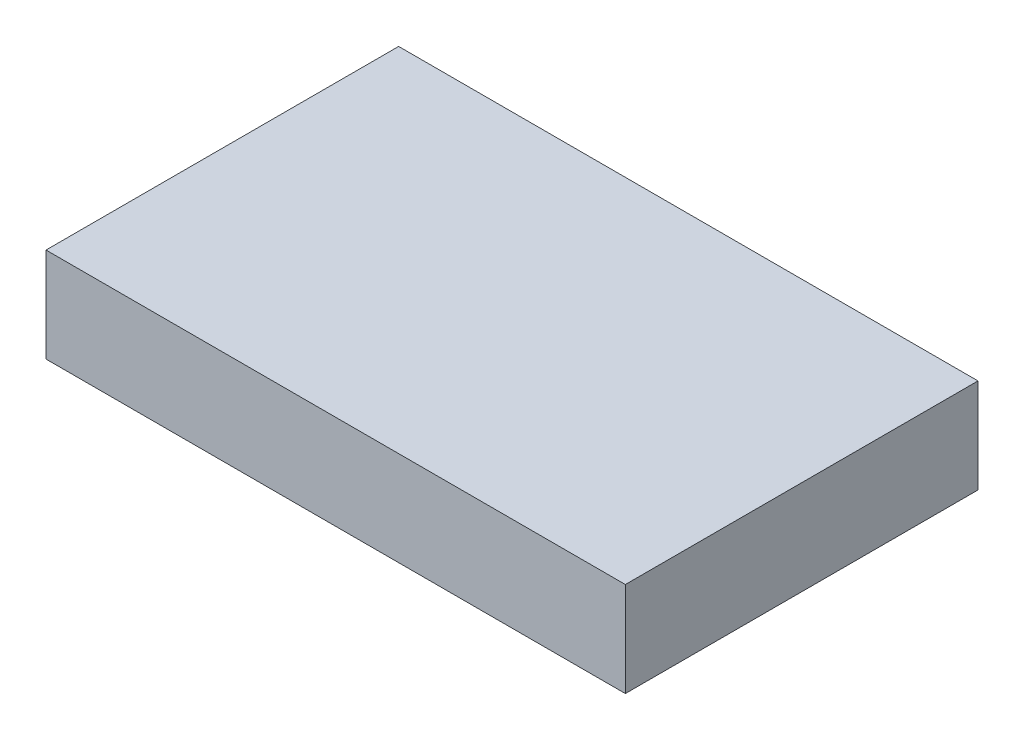
ISO-10303-21;
HEADER;
FILE_DESCRIPTION(('STEP AP214'),'2;1');
FILE_NAME('part.step','',(''),(''),'','','');
FILE_SCHEMA(('AUTOMOTIVE_DESIGN { 1 0 10303 214 1 1 1 1 }'));
ENDSEC;
DATA;
#1=APPLICATION_CONTEXT('core data for automotive mechanical design processes');
#2=APPLICATION_PROTOCOL_DEFINITION('international standard','automotive_design',2000,#1);
#3=PRODUCT_CONTEXT('',#1,'mechanical');
#4=PRODUCT('Part','Part','',(#3));
#5=PRODUCT_RELATED_PRODUCT_CATEGORY('part','',(#4));
#6=PRODUCT_DEFINITION_FORMATION('','',#4);
#7=PRODUCT_DEFINITION_CONTEXT('part definition',#1,'design');
#8=PRODUCT_DEFINITION('design','',#6,#7);
#9=PRODUCT_DEFINITION_SHAPE('','',#8);
#10=(LENGTH_UNIT() NAMED_UNIT(*) SI_UNIT(.MILLI.,.METRE.));
#11=(NAMED_UNIT(*) PLANE_ANGLE_UNIT() SI_UNIT($,.RADIAN.));
#12=(NAMED_UNIT(*) SI_UNIT($,.STERADIAN.) SOLID_ANGLE_UNIT());
#13=UNCERTAINTY_MEASURE_WITH_UNIT(LENGTH_MEASURE(1.E-05),#10,'distance_accuracy_value','');
#14=(GEOMETRIC_REPRESENTATION_CONTEXT(3) GLOBAL_UNCERTAINTY_ASSIGNED_CONTEXT((#13)) GLOBAL_UNIT_ASSIGNED_CONTEXT((#10,
#11,#12)) REPRESENTATION_CONTEXT('',''));
#15=CARTESIAN_POINT('',(0.,0.,0.));
#16=DIRECTION('',(0.,0.,1.));
#17=DIRECTION('',(1.,0.,0.));
#18=AXIS2_PLACEMENT_3D('',#15,#16,#17);
#19=CARTESIAN_POINT('',(-266.142857142857,15.,-115.821428571429));
#20=DIRECTION('',(1.,0.,0.));
#21=DIRECTION('',(0.,0.,-1.));
#22=AXIS2_PLACEMENT_3D('',#19,#20,#21);
#23=PLANE('',#22);
#24=DIRECTION('',(0.,0.,1.));
#25=VECTOR('',#24,1.);
#26=CARTESIAN_POINT('',(-266.142857142857,0.,-115.821428571429));
#27=LINE('',#26,#25);
#28=CARTESIAN_POINT('',(-266.142857142857,0.,-115.821428571429));
#29=VERTEX_POINT('',#28);
#30=CARTESIAN_POINT('',(-266.142857142857,0.,-59.8214285714287));
#31=VERTEX_POINT('',#30);
#32=EDGE_CURVE('E96',#29,#31,#27,.T.);
#33=ORIENTED_EDGE('',*,*,#32,.T.);
#34=DIRECTION('',(0.,-1.,0.));
#35=VECTOR('',#34,1.);
#36=CARTESIAN_POINT('',(-266.142857142857,15.,-59.8214285714287));
#37=LINE('',#36,#35);
#38=CARTESIAN_POINT('',(-266.142857142857,15.,-59.8214285714287));
#39=VERTEX_POINT('',#38);
#40=EDGE_CURVE('E11',#39,#31,#37,.T.);
#41=ORIENTED_EDGE('',*,*,#40,.F.);
#42=DIRECTION('',(0.,0.,1.));
#43=VECTOR('',#42,1.);
#44=CARTESIAN_POINT('',(-266.142857142857,15.,-115.821428571429));
#45=LINE('',#44,#43);
#46=CARTESIAN_POINT('',(-266.142857142857,15.,-115.821428571429));
#47=VERTEX_POINT('',#46);
#48=EDGE_CURVE('E84',#47,#39,#45,.T.);
#49=ORIENTED_EDGE('',*,*,#48,.F.);
#50=DIRECTION('',(0.,-1.,0.));
#51=VECTOR('',#50,1.);
#52=CARTESIAN_POINT('',(-266.142857142857,15.,-115.821428571429));
#53=LINE('',#52,#51);
#54=EDGE_CURVE('E92',#47,#29,#53,.T.);
#55=ORIENTED_EDGE('',*,*,#54,.T.);
#56=EDGE_LOOP('',(#33,#41,#49,#55));
#57=FACE_BOUND('',#56,.T.);
#58=ADVANCED_FACE('F33',(#57),#23,.F.);
#59=CARTESIAN_POINT('',(-266.142857142857,15.,-59.8214285714287));
#60=DIRECTION('',(0.,0.,-1.));
#61=DIRECTION('',(-1.,0.,0.));
#62=AXIS2_PLACEMENT_3D('',#59,#60,#61);
#63=PLANE('',#62);
#64=DIRECTION('',(1.,0.,0.));
#65=VECTOR('',#64,1.);
#66=CARTESIAN_POINT('',(-266.142857142857,0.,-59.8214285714287));
#67=LINE('',#66,#65);
#68=CARTESIAN_POINT('',(-174.142857142857,0.,-59.8214285714287));
#69=VERTEX_POINT('',#68);
#70=EDGE_CURVE('E88',#31,#69,#67,.T.);
#71=ORIENTED_EDGE('',*,*,#70,.T.);
#72=DIRECTION('',(0.,-1.,0.));
#73=VECTOR('',#72,1.);
#74=CARTESIAN_POINT('',(-174.142857142857,15.,-59.8214285714287));
#75=LINE('',#74,#73);
#76=CARTESIAN_POINT('',(-174.142857142857,15.,-59.8214285714287));
#77=VERTEX_POINT('',#76);
#78=EDGE_CURVE('E41',#77,#69,#75,.T.);
#79=ORIENTED_EDGE('',*,*,#78,.F.);
#80=DIRECTION('',(1.,0.,0.));
#81=VECTOR('',#80,1.);
#82=CARTESIAN_POINT('',(-266.142857142857,15.,-59.8214285714287));
#83=LINE('',#82,#81);
#84=EDGE_CURVE('E79',#39,#77,#83,.T.);
#85=ORIENTED_EDGE('',*,*,#84,.F.);
#86=ORIENTED_EDGE('',*,*,#40,.T.);
#87=EDGE_LOOP('',(#71,#79,#85,#86));
#88=FACE_BOUND('',#87,.T.);
#89=ADVANCED_FACE('F87',(#88),#63,.F.);
#90=CARTESIAN_POINT('',(-174.142857142857,15.,-115.821428571429));
#91=DIRECTION('',(-1.,0.,0.));
#92=DIRECTION('',(0.,0.,1.));
#93=AXIS2_PLACEMENT_3D('',#90,#91,#92);
#94=PLANE('',#93);
#95=DIRECTION('',(0.,0.,-1.));
#96=VECTOR('',#95,1.);
#97=CARTESIAN_POINT('',(-174.142857142857,0.,-115.821428571429));
#98=LINE('',#97,#96);
#99=CARTESIAN_POINT('',(-174.142857142857,0.,-115.821428571429));
#100=VERTEX_POINT('',#99);
#101=EDGE_CURVE('E66',#69,#100,#98,.T.);
#102=ORIENTED_EDGE('',*,*,#101,.T.);
#103=DIRECTION('',(0.,-1.,0.));
#104=VECTOR('',#103,1.);
#105=CARTESIAN_POINT('',(-174.142857142857,15.,-115.821428571429));
#106=LINE('',#105,#104);
#107=CARTESIAN_POINT('',(-174.142857142857,15.,-115.821428571429));
#108=VERTEX_POINT('',#107);
#109=EDGE_CURVE('E89',#108,#100,#106,.T.);
#110=ORIENTED_EDGE('',*,*,#109,.F.);
#111=DIRECTION('',(0.,0.,-1.));
#112=VECTOR('',#111,1.);
#113=CARTESIAN_POINT('',(-174.142857142857,15.,-115.821428571429));
#114=LINE('',#113,#112);
#115=EDGE_CURVE('E82',#77,#108,#114,.T.);
#116=ORIENTED_EDGE('',*,*,#115,.F.);
#117=ORIENTED_EDGE('',*,*,#78,.T.);
#118=EDGE_LOOP('',(#102,#110,#116,#117));
#119=FACE_BOUND('',#118,.T.);
#120=ADVANCED_FACE('F90',(#119),#94,.F.);
#121=CARTESIAN_POINT('',(-266.142857142857,15.,-115.821428571429));
#122=DIRECTION('',(0.,0.,1.));
#123=DIRECTION('',(1.,0.,0.));
#124=AXIS2_PLACEMENT_3D('',#121,#122,#123);
#125=PLANE('',#124);
#126=DIRECTION('',(-1.,0.,0.));
#127=VECTOR('',#126,1.);
#128=CARTESIAN_POINT('',(-266.142857142857,0.,-115.821428571429));
#129=LINE('',#128,#127);
#130=EDGE_CURVE('E72',#100,#29,#129,.T.);
#131=ORIENTED_EDGE('',*,*,#130,.T.);
#132=ORIENTED_EDGE('',*,*,#54,.F.);
#133=DIRECTION('',(-1.,0.,0.));
#134=VECTOR('',#133,1.);
#135=CARTESIAN_POINT('',(-266.142857142857,15.,-115.821428571429));
#136=LINE('',#135,#134);
#137=EDGE_CURVE('E49',#108,#47,#136,.T.);
#138=ORIENTED_EDGE('',*,*,#137,.F.);
#139=ORIENTED_EDGE('',*,*,#109,.T.);
#140=EDGE_LOOP('',(#131,#132,#138,#139));
#141=FACE_BOUND('',#140,.T.);
#142=ADVANCED_FACE('F103',(#141),#125,.F.);
#143=CARTESIAN_POINT('',(0.,15.,0.));
#144=DIRECTION('',(0.,1.,0.));
#145=DIRECTION('',(0.,0.,1.));
#146=AXIS2_PLACEMENT_3D('',#143,#144,#145);
#147=PLANE('',#146);
#148=ORIENTED_EDGE('',*,*,#48,.T.);
#149=ORIENTED_EDGE('',*,*,#84,.T.);
#150=ORIENTED_EDGE('',*,*,#115,.T.);
#151=ORIENTED_EDGE('',*,*,#137,.T.);
#152=EDGE_LOOP('',(#148,#149,#150,#151));
#153=FACE_BOUND('',#152,.T.);
#154=ADVANCED_FACE('F80',(#153),#147,.T.);
#155=CARTESIAN_POINT('',(0.,0.,0.));
#156=DIRECTION('',(0.,1.,0.));
#157=DIRECTION('',(0.,0.,1.));
#158=AXIS2_PLACEMENT_3D('',#155,#156,#157);
#159=PLANE('',#158);
#160=ORIENTED_EDGE('',*,*,#32,.F.);
#161=ORIENTED_EDGE('',*,*,#130,.F.);
#162=ORIENTED_EDGE('',*,*,#101,.F.);
#163=ORIENTED_EDGE('',*,*,#70,.F.);
#164=EDGE_LOOP('',(#160,#161,#162,#163));
#165=FACE_BOUND('',#164,.T.);
#166=ADVANCED_FACE('F106',(#165),#159,.F.);
#167=CLOSED_SHELL('',(#58,#89,#120,#142,#154,#166));
#168=MANIFOLD_SOLID_BREP('B2',#167);
#169=ADVANCED_BREP_SHAPE_REPRESENTATION('',(#18,#168),#14);
#170=SHAPE_DEFINITION_REPRESENTATION(#9,#169);
ENDSEC;
END-ISO-10303-21;
